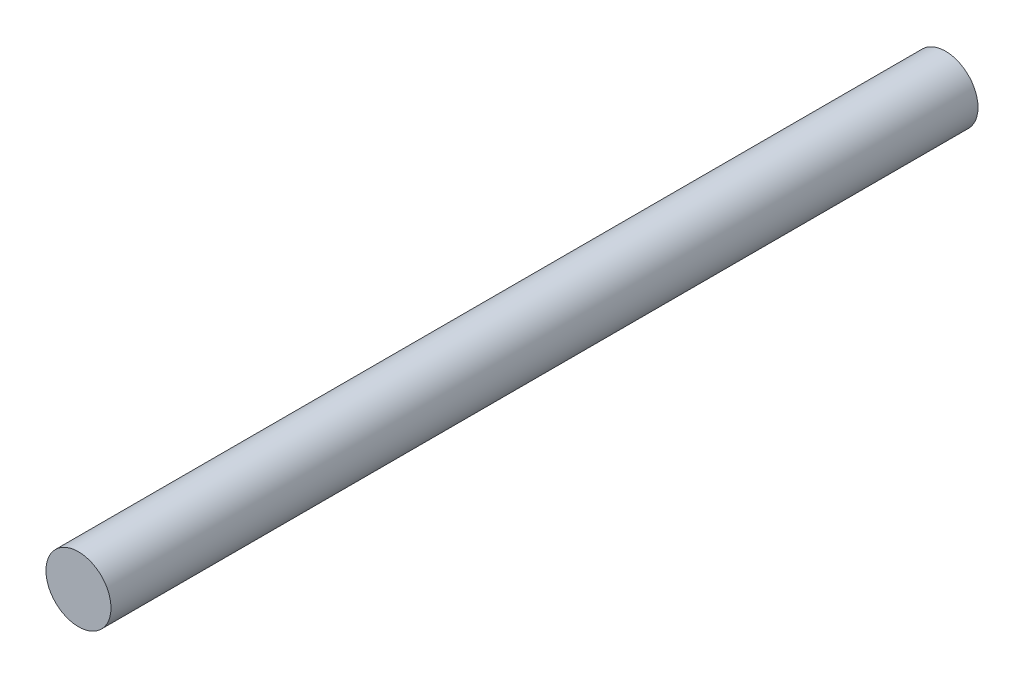
ISO-10303-21;
HEADER;
FILE_DESCRIPTION(('STEP AP214'),'2;1');
FILE_NAME('part.step','',(''),(''),'','','');
FILE_SCHEMA(('AUTOMOTIVE_DESIGN { 1 0 10303 214 1 1 1 1 }'));
ENDSEC;
DATA;
#1=APPLICATION_CONTEXT('core data for automotive mechanical design processes');
#2=APPLICATION_PROTOCOL_DEFINITION('international standard','automotive_design',2000,#1);
#3=PRODUCT_CONTEXT('',#1,'mechanical');
#4=PRODUCT('Part','Part','',(#3));
#5=PRODUCT_RELATED_PRODUCT_CATEGORY('part','',(#4));
#6=PRODUCT_DEFINITION_FORMATION('','',#4);
#7=PRODUCT_DEFINITION_CONTEXT('part definition',#1,'design');
#8=PRODUCT_DEFINITION('design','',#6,#7);
#9=PRODUCT_DEFINITION_SHAPE('','',#8);
#10=(LENGTH_UNIT() NAMED_UNIT(*) SI_UNIT(.MILLI.,.METRE.));
#11=(NAMED_UNIT(*) PLANE_ANGLE_UNIT() SI_UNIT($,.RADIAN.));
#12=(NAMED_UNIT(*) SI_UNIT($,.STERADIAN.) SOLID_ANGLE_UNIT());
#13=UNCERTAINTY_MEASURE_WITH_UNIT(LENGTH_MEASURE(1.E-05),#10,'distance_accuracy_value','');
#14=(GEOMETRIC_REPRESENTATION_CONTEXT(3) GLOBAL_UNCERTAINTY_ASSIGNED_CONTEXT((#13)) GLOBAL_UNIT_ASSIGNED_CONTEXT((#10,
#11,#12)) REPRESENTATION_CONTEXT('',''));
#15=CARTESIAN_POINT('',(0.,0.,0.));
#16=DIRECTION('',(0.,0.,1.));
#17=DIRECTION('',(1.,0.,0.));
#18=AXIS2_PLACEMENT_3D('',#15,#16,#17);
#19=CARTESIAN_POINT('',(0.,0.,127.));
#20=DIRECTION('',(0.,0.,-1.));
#21=DIRECTION('',(-1.,0.,0.));
#22=AXIS2_PLACEMENT_3D('',#19,#20,#21);
#23=CYLINDRICAL_SURFACE('',#22,4.7625);
#24=CARTESIAN_POINT('',(0.,0.,127.));
#25=DIRECTION('',(0.,0.,1.));
#26=DIRECTION('',(1.,0.,0.));
#27=AXIS2_PLACEMENT_3D('',#24,#25,#26);
#28=CIRCLE('',#27,4.7625);
#29=CARTESIAN_POINT('',(4.7625,0.,127.));
#30=VERTEX_POINT('',#29);
#31=EDGE_CURVE('E10',#30,#30,#28,.T.);
#32=ORIENTED_EDGE('',*,*,#31,.F.);
#33=EDGE_LOOP('',(#32));
#34=FACE_BOUND('',#33,.T.);
#35=CARTESIAN_POINT('',(0.,0.,0.));
#36=DIRECTION('',(0.,0.,1.));
#37=DIRECTION('',(1.,0.,0.));
#38=AXIS2_PLACEMENT_3D('',#35,#36,#37);
#39=CIRCLE('',#38,4.7625);
#40=CARTESIAN_POINT('',(4.7625,0.,0.));
#41=VERTEX_POINT('',#40);
#42=EDGE_CURVE('E34',#41,#41,#39,.T.);
#43=ORIENTED_EDGE('',*,*,#42,.T.);
#44=EDGE_LOOP('',(#43));
#45=FACE_BOUND('',#44,.T.);
#46=ADVANCED_FACE('F31',(#34,#45),#23,.T.);
#47=CARTESIAN_POINT('',(0.,0.,127.));
#48=DIRECTION('',(0.,0.,1.));
#49=DIRECTION('',(1.,0.,0.));
#50=AXIS2_PLACEMENT_3D('',#47,#48,#49);
#51=PLANE('',#50);
#52=ORIENTED_EDGE('',*,*,#31,.T.);
#53=EDGE_LOOP('',(#52));
#54=FACE_BOUND('',#53,.T.);
#55=ADVANCED_FACE('F46',(#54),#51,.T.);
#56=CARTESIAN_POINT('',(0.,0.,0.));
#57=DIRECTION('',(0.,0.,1.));
#58=DIRECTION('',(1.,0.,0.));
#59=AXIS2_PLACEMENT_3D('',#56,#57,#58);
#60=PLANE('',#59);
#61=ORIENTED_EDGE('',*,*,#42,.F.);
#62=EDGE_LOOP('',(#61));
#63=FACE_BOUND('',#62,.T.);
#64=ADVANCED_FACE('F44',(#63),#60,.F.);
#65=CLOSED_SHELL('',(#46,#55,#64));
#66=MANIFOLD_SOLID_BREP('B2',#65);
#67=ADVANCED_BREP_SHAPE_REPRESENTATION('',(#18,#66),#14);
#68=SHAPE_DEFINITION_REPRESENTATION(#9,#67);
ENDSEC;
END-ISO-10303-21;
